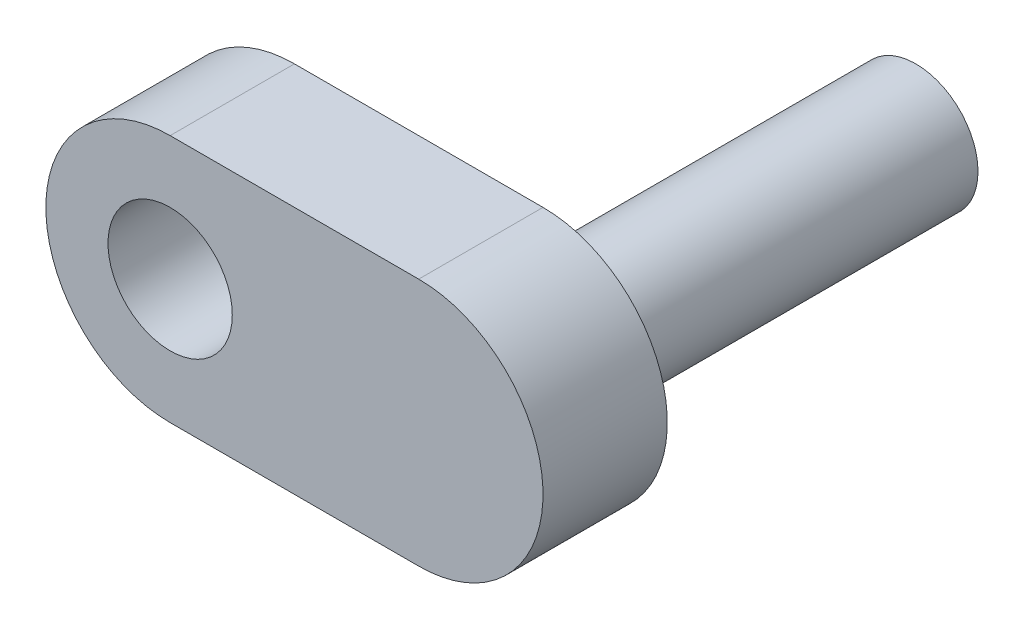
ISO-10303-21;
HEADER;
FILE_DESCRIPTION(('STEP AP214'),'2;1');
FILE_NAME('part.step','',(''),(''),'','','');
FILE_SCHEMA(('AUTOMOTIVE_DESIGN { 1 0 10303 214 1 1 1 1 }'));
ENDSEC;
DATA;
#1=APPLICATION_CONTEXT('core data for automotive mechanical design processes');
#2=APPLICATION_PROTOCOL_DEFINITION('international standard','automotive_design',2000,#1);
#3=PRODUCT_CONTEXT('',#1,'mechanical');
#4=PRODUCT('Part','Part','',(#3));
#5=PRODUCT_RELATED_PRODUCT_CATEGORY('part','',(#4));
#6=PRODUCT_DEFINITION_FORMATION('','',#4);
#7=PRODUCT_DEFINITION_CONTEXT('part definition',#1,'design');
#8=PRODUCT_DEFINITION('design','',#6,#7);
#9=PRODUCT_DEFINITION_SHAPE('','',#8);
#10=(LENGTH_UNIT() NAMED_UNIT(*) SI_UNIT(.MILLI.,.METRE.));
#11=(NAMED_UNIT(*) PLANE_ANGLE_UNIT() SI_UNIT($,.RADIAN.));
#12=(NAMED_UNIT(*) SI_UNIT($,.STERADIAN.) SOLID_ANGLE_UNIT());
#13=UNCERTAINTY_MEASURE_WITH_UNIT(LENGTH_MEASURE(1.E-05),#10,'distance_accuracy_value','');
#14=(GEOMETRIC_REPRESENTATION_CONTEXT(3) GLOBAL_UNCERTAINTY_ASSIGNED_CONTEXT((#13)) GLOBAL_UNIT_ASSIGNED_CONTEXT((#10,
#11,#12)) REPRESENTATION_CONTEXT('',''));
#15=CARTESIAN_POINT('',(0.,0.,0.));
#16=DIRECTION('',(0.,0.,1.));
#17=DIRECTION('',(1.,0.,0.));
#18=AXIS2_PLACEMENT_3D('',#15,#16,#17);
#19=CARTESIAN_POINT('',(-13.9047100792067,0.,5.));
#20=DIRECTION('',(0.,0.,1.));
#21=DIRECTION('',(1.,0.,0.));
#22=AXIS2_PLACEMENT_3D('',#19,#20,#21);
#23=PLANE('',#22);
#24=CARTESIAN_POINT('',(-13.9047100792067,0.,5.));
#25=DIRECTION('',(0.,0.,1.));
#26=DIRECTION('',(1.,0.,0.));
#27=AXIS2_PLACEMENT_3D('',#24,#25,#26);
#28=CIRCLE('',#27,5.);
#29=CARTESIAN_POINT('',(-13.9047100792067,5.,5.));
#30=VERTEX_POINT('',#29);
#31=CARTESIAN_POINT('',(-13.9047100792067,-5.,5.));
#32=VERTEX_POINT('',#31);
#33=EDGE_CURVE('E97',#30,#32,#28,.T.);
#34=ORIENTED_EDGE('',*,*,#33,.T.);
#35=DIRECTION('',(1.,0.,0.));
#36=VECTOR('',#35,1.);
#37=CARTESIAN_POINT('',(-13.9047100792067,-5.,5.));
#38=LINE('',#37,#36);
#39=CARTESIAN_POINT('',(-3.90471007920673,-5.,5.));
#40=VERTEX_POINT('',#39);
#41=EDGE_CURVE('E90',#32,#40,#38,.T.);
#42=ORIENTED_EDGE('',*,*,#41,.T.);
#43=CARTESIAN_POINT('',(-3.90471007920672,0.,5.));
#44=DIRECTION('',(0.,0.,1.));
#45=DIRECTION('',(1.,0.,0.));
#46=AXIS2_PLACEMENT_3D('',#43,#44,#45);
#47=CIRCLE('',#46,5.);
#48=CARTESIAN_POINT('',(-3.90471007920672,5.,5.));
#49=VERTEX_POINT('',#48);
#50=EDGE_CURVE('E96',#40,#49,#47,.T.);
#51=ORIENTED_EDGE('',*,*,#50,.T.);
#52=DIRECTION('',(1.,0.,0.));
#53=VECTOR('',#52,1.);
#54=CARTESIAN_POINT('',(-13.9047100792067,5.,5.));
#55=LINE('',#54,#53);
#56=EDGE_CURVE('E106',#30,#49,#55,.T.);
#57=ORIENTED_EDGE('',*,*,#56,.F.);
#58=EDGE_LOOP('',(#34,#42,#51,#57));
#59=FACE_BOUND('',#58,.T.);
#60=CARTESIAN_POINT('',(-13.9047100792067,0.,5.));
#61=DIRECTION('',(0.,0.,1.));
#62=DIRECTION('',(1.,0.,0.));
#63=AXIS2_PLACEMENT_3D('',#60,#61,#62);
#64=CIRCLE('',#63,2.5);
#65=CARTESIAN_POINT('',(-11.4047100792067,0.,5.));
#66=VERTEX_POINT('',#65);
#67=EDGE_CURVE('E113',#66,#66,#64,.T.);
#68=ORIENTED_EDGE('',*,*,#67,.F.);
#69=EDGE_LOOP('',(#68));
#70=FACE_BOUND('',#69,.T.);
#71=ADVANCED_FACE('F47',(#59,#70),#23,.T.);
#72=CARTESIAN_POINT('',(-13.9047100792067,0.,0.));
#73=DIRECTION('',(0.,0.,1.));
#74=DIRECTION('',(1.,0.,0.));
#75=AXIS2_PLACEMENT_3D('',#72,#73,#74);
#76=PLANE('',#75);
#77=CARTESIAN_POINT('',(-3.90471007920672,0.,0.));
#78=DIRECTION('',(0.,0.,1.));
#79=DIRECTION('',(1.,0.,0.));
#80=AXIS2_PLACEMENT_3D('',#77,#78,#79);
#81=CIRCLE('',#80,2.5);
#82=CARTESIAN_POINT('',(-1.40471007920672,0.,0.));
#83=VERTEX_POINT('',#82);
#84=EDGE_CURVE('E129',#83,#83,#81,.T.);
#85=ORIENTED_EDGE('',*,*,#84,.T.);
#86=EDGE_LOOP('',(#85));
#87=FACE_BOUND('',#86,.T.);
#88=CARTESIAN_POINT('',(-13.9047100792067,0.,0.));
#89=DIRECTION('',(0.,0.,1.));
#90=DIRECTION('',(1.,0.,0.));
#91=AXIS2_PLACEMENT_3D('',#88,#89,#90);
#92=CIRCLE('',#91,5.);
#93=CARTESIAN_POINT('',(-13.9047100792067,5.,0.));
#94=VERTEX_POINT('',#93);
#95=CARTESIAN_POINT('',(-13.9047100792067,-5.,0.));
#96=VERTEX_POINT('',#95);
#97=EDGE_CURVE('E111',#94,#96,#92,.T.);
#98=ORIENTED_EDGE('',*,*,#97,.F.);
#99=DIRECTION('',(1.,0.,0.));
#100=VECTOR('',#99,1.);
#101=CARTESIAN_POINT('',(-13.9047100792067,5.,0.));
#102=LINE('',#101,#100);
#103=CARTESIAN_POINT('',(-3.90471007920672,5.,0.));
#104=VERTEX_POINT('',#103);
#105=EDGE_CURVE('E117',#94,#104,#102,.T.);
#106=ORIENTED_EDGE('',*,*,#105,.T.);
#107=CARTESIAN_POINT('',(-3.90471007920672,0.,0.));
#108=DIRECTION('',(0.,0.,1.));
#109=DIRECTION('',(1.,0.,0.));
#110=AXIS2_PLACEMENT_3D('',#107,#108,#109);
#111=CIRCLE('',#110,5.);
#112=CARTESIAN_POINT('',(-3.90471007920673,-5.,0.));
#113=VERTEX_POINT('',#112);
#114=EDGE_CURVE('E115',#113,#104,#111,.T.);
#115=ORIENTED_EDGE('',*,*,#114,.F.);
#116=DIRECTION('',(1.,0.,0.));
#117=VECTOR('',#116,1.);
#118=CARTESIAN_POINT('',(-13.9047100792067,-5.,0.));
#119=LINE('',#118,#117);
#120=EDGE_CURVE('E102',#96,#113,#119,.T.);
#121=ORIENTED_EDGE('',*,*,#120,.F.);
#122=EDGE_LOOP('',(#98,#106,#115,#121));
#123=FACE_BOUND('',#122,.T.);
#124=CARTESIAN_POINT('',(-13.9047100792067,0.,0.));
#125=DIRECTION('',(0.,0.,1.));
#126=DIRECTION('',(1.,0.,0.));
#127=AXIS2_PLACEMENT_3D('',#124,#125,#126);
#128=CIRCLE('',#127,2.5);
#129=CARTESIAN_POINT('',(-11.4047100792067,0.,0.));
#130=VERTEX_POINT('',#129);
#131=EDGE_CURVE('E123',#130,#130,#128,.T.);
#132=ORIENTED_EDGE('',*,*,#131,.T.);
#133=EDGE_LOOP('',(#132));
#134=FACE_BOUND('',#133,.T.);
#135=ADVANCED_FACE('F147',(#87,#123,#134),#76,.F.);
#136=CARTESIAN_POINT('',(-13.9047100792067,0.,5.));
#137=DIRECTION('',(0.,0.,-1.));
#138=DIRECTION('',(-1.,0.,0.));
#139=AXIS2_PLACEMENT_3D('',#136,#137,#138);
#140=CYLINDRICAL_SURFACE('',#139,5.);
#141=ORIENTED_EDGE('',*,*,#97,.T.);
#142=DIRECTION('',(0.,0.,-1.));
#143=VECTOR('',#142,1.);
#144=CARTESIAN_POINT('',(-13.9047100792067,-5.,5.));
#145=LINE('',#144,#143);
#146=EDGE_CURVE('E12',#32,#96,#145,.T.);
#147=ORIENTED_EDGE('',*,*,#146,.F.);
#148=ORIENTED_EDGE('',*,*,#33,.F.);
#149=DIRECTION('',(0.,0.,-1.));
#150=VECTOR('',#149,1.);
#151=CARTESIAN_POINT('',(-13.9047100792067,5.,5.));
#152=LINE('',#151,#150);
#153=EDGE_CURVE('E64',#30,#94,#152,.T.);
#154=ORIENTED_EDGE('',*,*,#153,.T.);
#155=EDGE_LOOP('',(#141,#147,#148,#154));
#156=FACE_BOUND('',#155,.T.);
#157=ADVANCED_FACE('F49',(#156),#140,.T.);
#158=CARTESIAN_POINT('',(-13.9047100792067,-5.,5.));
#159=DIRECTION('',(0.,1.,0.));
#160=DIRECTION('',(0.,0.,1.));
#161=AXIS2_PLACEMENT_3D('',#158,#159,#160);
#162=PLANE('',#161);
#163=ORIENTED_EDGE('',*,*,#120,.T.);
#164=DIRECTION('',(0.,0.,-1.));
#165=VECTOR('',#164,1.);
#166=CARTESIAN_POINT('',(-3.90471007920673,-5.,5.));
#167=LINE('',#166,#165);
#168=EDGE_CURVE('E56',#40,#113,#167,.T.);
#169=ORIENTED_EDGE('',*,*,#168,.F.);
#170=ORIENTED_EDGE('',*,*,#41,.F.);
#171=ORIENTED_EDGE('',*,*,#146,.T.);
#172=EDGE_LOOP('',(#163,#169,#170,#171));
#173=FACE_BOUND('',#172,.T.);
#174=ADVANCED_FACE('F101',(#173),#162,.F.);
#175=CARTESIAN_POINT('',(-3.90471007920672,0.,5.));
#176=DIRECTION('',(0.,0.,-1.));
#177=DIRECTION('',(-1.,0.,0.));
#178=AXIS2_PLACEMENT_3D('',#175,#176,#177);
#179=CYLINDRICAL_SURFACE('',#178,5.);
#180=ORIENTED_EDGE('',*,*,#114,.T.);
#181=DIRECTION('',(0.,0.,-1.));
#182=VECTOR('',#181,1.);
#183=CARTESIAN_POINT('',(-3.90471007920672,5.,5.));
#184=LINE('',#183,#182);
#185=EDGE_CURVE('E79',#49,#104,#184,.T.);
#186=ORIENTED_EDGE('',*,*,#185,.F.);
#187=ORIENTED_EDGE('',*,*,#50,.F.);
#188=ORIENTED_EDGE('',*,*,#168,.T.);
#189=EDGE_LOOP('',(#180,#186,#187,#188));
#190=FACE_BOUND('',#189,.T.);
#191=ADVANCED_FACE('F105',(#190),#179,.T.);
#192=CARTESIAN_POINT('',(-13.9047100792067,5.,5.));
#193=DIRECTION('',(0.,1.,0.));
#194=DIRECTION('',(0.,0.,1.));
#195=AXIS2_PLACEMENT_3D('',#192,#193,#194);
#196=PLANE('',#195);
#197=ORIENTED_EDGE('',*,*,#105,.F.);
#198=ORIENTED_EDGE('',*,*,#153,.F.);
#199=ORIENTED_EDGE('',*,*,#56,.T.);
#200=ORIENTED_EDGE('',*,*,#185,.T.);
#201=EDGE_LOOP('',(#197,#198,#199,#200));
#202=FACE_BOUND('',#201,.T.);
#203=ADVANCED_FACE('F156',(#202),#196,.T.);
#204=CARTESIAN_POINT('',(-13.9047100792067,0.,5.));
#205=DIRECTION('',(0.,0.,-1.));
#206=DIRECTION('',(-1.,0.,0.));
#207=AXIS2_PLACEMENT_3D('',#204,#205,#206);
#208=CYLINDRICAL_SURFACE('',#207,2.5);
#209=ORIENTED_EDGE('',*,*,#67,.T.);
#210=EDGE_LOOP('',(#209));
#211=FACE_BOUND('',#210,.T.);
#212=ORIENTED_EDGE('',*,*,#131,.F.);
#213=EDGE_LOOP('',(#212));
#214=FACE_BOUND('',#213,.T.);
#215=ADVANCED_FACE('F144',(#211,#214),#208,.F.);
#216=CARTESIAN_POINT('',(-3.90471007920672,0.,-15.));
#217=DIRECTION('',(0.,0.,1.));
#218=DIRECTION('',(1.,0.,0.));
#219=AXIS2_PLACEMENT_3D('',#216,#217,#218);
#220=CYLINDRICAL_SURFACE('',#219,2.5);
#221=CARTESIAN_POINT('',(-3.90471007920672,0.,-15.));
#222=DIRECTION('',(0.,0.,1.));
#223=DIRECTION('',(1.,0.,0.));
#224=AXIS2_PLACEMENT_3D('',#221,#222,#223);
#225=CIRCLE('',#224,2.5);
#226=CARTESIAN_POINT('',(-1.40471007920672,0.,-15.));
#227=VERTEX_POINT('',#226);
#228=EDGE_CURVE('E126',#227,#227,#225,.T.);
#229=ORIENTED_EDGE('',*,*,#228,.T.);
#230=EDGE_LOOP('',(#229));
#231=FACE_BOUND('',#230,.T.);
#232=ORIENTED_EDGE('',*,*,#84,.F.);
#233=EDGE_LOOP('',(#232));
#234=FACE_BOUND('',#233,.T.);
#235=ADVANCED_FACE('F135',(#231,#234),#220,.T.);
#236=CARTESIAN_POINT('',(-3.90471007920672,0.,-15.));
#237=DIRECTION('',(0.,0.,1.));
#238=DIRECTION('',(1.,0.,0.));
#239=AXIS2_PLACEMENT_3D('',#236,#237,#238);
#240=PLANE('',#239);
#241=ORIENTED_EDGE('',*,*,#228,.F.);
#242=EDGE_LOOP('',(#241));
#243=FACE_BOUND('',#242,.T.);
#244=ADVANCED_FACE('F138',(#243),#240,.F.);
#245=CLOSED_SHELL('',(#71,#135,#157,#174,#191,#203,#215,#235,#244));
#246=MANIFOLD_SOLID_BREP('B2',#245);
#247=ADVANCED_BREP_SHAPE_REPRESENTATION('',(#18,#246),#14);
#248=SHAPE_DEFINITION_REPRESENTATION(#9,#247);
ENDSEC;
END-ISO-10303-21;
